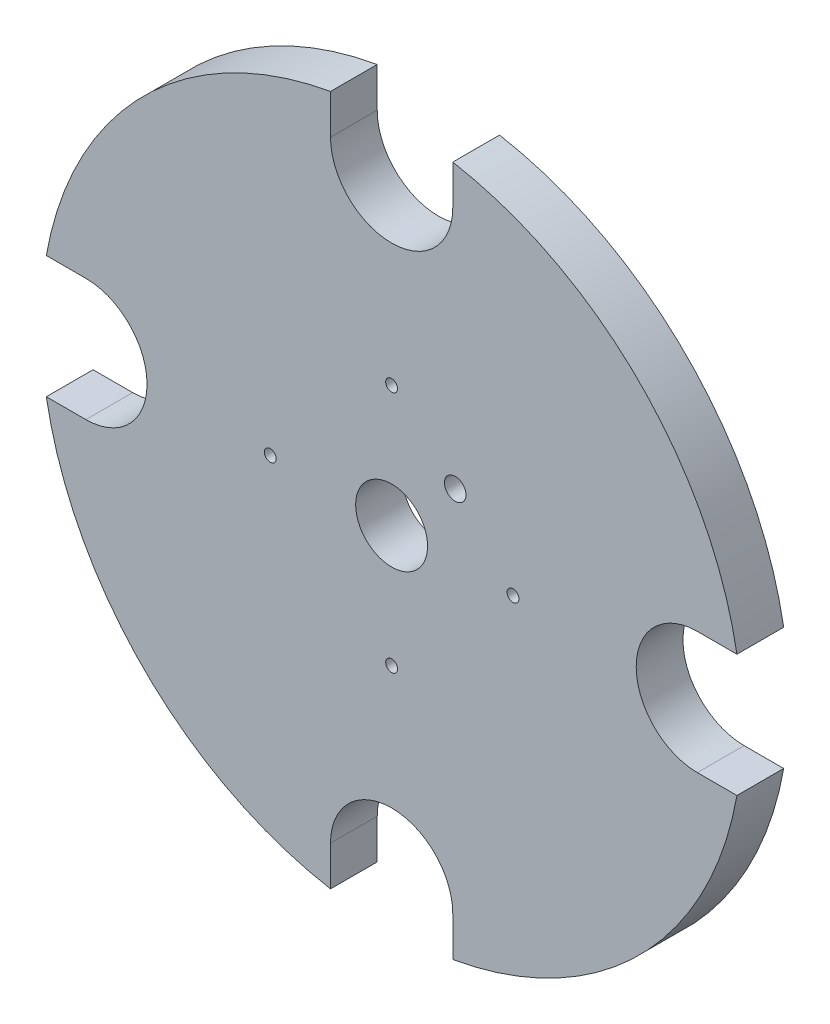
ISO-10303-21;
HEADER;
FILE_DESCRIPTION(('STEP AP214'),'2;1');
FILE_NAME('part.step','',(''),(''),'','','');
FILE_SCHEMA(('AUTOMOTIVE_DESIGN { 1 0 10303 214 1 1 1 1 }'));
ENDSEC;
DATA;
#1=APPLICATION_CONTEXT('core data for automotive mechanical design processes');
#2=APPLICATION_PROTOCOL_DEFINITION('international standard','automotive_design',2000,#1);
#3=PRODUCT_CONTEXT('',#1,'mechanical');
#4=PRODUCT('Part','Part','',(#3));
#5=PRODUCT_RELATED_PRODUCT_CATEGORY('part','',(#4));
#6=PRODUCT_DEFINITION_FORMATION('','',#4);
#7=PRODUCT_DEFINITION_CONTEXT('part definition',#1,'design');
#8=PRODUCT_DEFINITION('design','',#6,#7);
#9=PRODUCT_DEFINITION_SHAPE('','',#8);
#10=(LENGTH_UNIT() NAMED_UNIT(*) SI_UNIT(.MILLI.,.METRE.));
#11=(NAMED_UNIT(*) PLANE_ANGLE_UNIT() SI_UNIT($,.RADIAN.));
#12=(NAMED_UNIT(*) SI_UNIT($,.STERADIAN.) SOLID_ANGLE_UNIT());
#13=UNCERTAINTY_MEASURE_WITH_UNIT(LENGTH_MEASURE(1.E-05),#10,'distance_accuracy_value','');
#14=(GEOMETRIC_REPRESENTATION_CONTEXT(3) GLOBAL_UNCERTAINTY_ASSIGNED_CONTEXT((#13)) GLOBAL_UNIT_ASSIGNED_CONTEXT((#10,
#11,#12)) REPRESENTATION_CONTEXT('',''));
#15=CARTESIAN_POINT('',(0.,0.,0.));
#16=DIRECTION('',(0.,0.,1.));
#17=DIRECTION('',(1.,0.,0.));
#18=AXIS2_PLACEMENT_3D('',#15,#16,#17);
#19=CARTESIAN_POINT('',(35.3553390593274,35.3553390593274,-1.04603825601401E-11));
#20=DIRECTION('',(0.,0.,1.));
#21=DIRECTION('',(1.,0.,0.));
#22=AXIS2_PLACEMENT_3D('',#19,#20,#21);
#23=CYLINDRICAL_SURFACE('',#22,6.00000000000001);
#24=CARTESIAN_POINT('',(35.3553390593274,35.3553390593274,26.));
#25=DIRECTION('',(0.,0.,1.));
#26=DIRECTION('',(1.,0.,0.));
#27=AXIS2_PLACEMENT_3D('',#24,#25,#26);
#28=CIRCLE('',#27,6.00000000000001);
#29=CARTESIAN_POINT('',(41.3553390593274,35.3553390593274,26.));
#30=VERTEX_POINT('',#29);
#31=EDGE_CURVE('E382',#30,#30,#28,.T.);
#32=ORIENTED_EDGE('',*,*,#31,.T.);
#33=EDGE_LOOP('',(#32));
#34=FACE_BOUND('',#33,.T.);
#35=CARTESIAN_POINT('',(35.3553390593274,35.3553390593274,14.));
#36=DIRECTION('',(0.,0.,-1.));
#37=DIRECTION('',(-1.,0.,0.));
#38=AXIS2_PLACEMENT_3D('',#35,#36,#37);
#39=CIRCLE('',#38,6.00000000000001);
#40=CARTESIAN_POINT('',(29.3553390593274,35.3553390593274,14.));
#41=VERTEX_POINT('',#40);
#42=EDGE_CURVE('E37',#41,#41,#39,.F.);
#43=ORIENTED_EDGE('',*,*,#42,.F.);
#44=EDGE_LOOP('',(#43));
#45=FACE_BOUND('',#44,.T.);
#46=ADVANCED_FACE('F33',(#34,#45),#23,.F.);
#47=CARTESIAN_POINT('',(0.,0.,26.));
#48=DIRECTION('',(0.,0.,-1.));
#49=DIRECTION('',(-1.,0.,0.));
#50=AXIS2_PLACEMENT_3D('',#47,#48,#49);
#51=CYLINDRICAL_SURFACE('',#50,195.);
#52=CARTESIAN_POINT('',(0.,0.,26.));
#53=DIRECTION('',(0.,0.,1.));
#54=DIRECTION('',(1.,0.,0.));
#55=AXIS2_PLACEMENT_3D('',#52,#53,#54);
#56=CIRCLE('',#55,195.);
#57=CARTESIAN_POINT('',(-33.999999999998,192.013020391848,26.));
#58=VERTEX_POINT('',#57);
#59=CARTESIAN_POINT('',(-192.013020391847,34.0000000000013,26.));
#60=VERTEX_POINT('',#59);
#61=EDGE_CURVE('E42',#58,#60,#56,.T.);
#62=ORIENTED_EDGE('',*,*,#61,.F.);
#63=DIRECTION('',(0.,0.,1.));
#64=VECTOR('',#63,1.);
#65=CARTESIAN_POINT('',(-33.999999999998,192.013020391848,0.));
#66=LINE('',#65,#64);
#67=CARTESIAN_POINT('',(-33.999999999998,192.013020391848,0.));
#68=VERTEX_POINT('',#67);
#69=EDGE_CURVE('E181',#68,#58,#66,.T.);
#70=ORIENTED_EDGE('',*,*,#69,.F.);
#71=CARTESIAN_POINT('',(0.,0.,0.));
#72=DIRECTION('',(0.,0.,1.));
#73=DIRECTION('',(1.,0.,0.));
#74=AXIS2_PLACEMENT_3D('',#71,#72,#73);
#75=CIRCLE('',#74,195.);
#76=CARTESIAN_POINT('',(-192.013020391847,34.0000000000014,0.));
#77=VERTEX_POINT('',#76);
#78=EDGE_CURVE('E272',#68,#77,#75,.T.);
#79=ORIENTED_EDGE('',*,*,#78,.T.);
#80=DIRECTION('',(0.,0.,1.));
#81=VECTOR('',#80,1.);
#82=CARTESIAN_POINT('',(-192.013020391847,34.0000000000014,0.));
#83=LINE('',#82,#81);
#84=EDGE_CURVE('E206',#77,#60,#83,.T.);
#85=ORIENTED_EDGE('',*,*,#84,.T.);
#86=EDGE_LOOP('',(#62,#70,#79,#85));
#87=FACE_BOUND('',#86,.T.);
#88=ADVANCED_FACE('F313',(#87),#51,.T.);
#89=CARTESIAN_POINT('',(-192.013020391848,-33.9999999999987,26.));
#90=VERTEX_POINT('',#89);
#91=CARTESIAN_POINT('',(-34.0000000000007,-192.013020391847,26.));
#92=VERTEX_POINT('',#91);
#93=EDGE_CURVE('E276',#90,#92,#56,.T.);
#94=ORIENTED_EDGE('',*,*,#93,.F.);
#95=DIRECTION('',(0.,0.,1.));
#96=VECTOR('',#95,1.);
#97=CARTESIAN_POINT('',(-192.013020391848,-33.9999999999987,0.));
#98=LINE('',#97,#96);
#99=CARTESIAN_POINT('',(-192.013020391848,-33.9999999999987,0.));
#100=VERTEX_POINT('',#99);
#101=EDGE_CURVE('E204',#100,#90,#98,.T.);
#102=ORIENTED_EDGE('',*,*,#101,.F.);
#103=CARTESIAN_POINT('',(-34.0000000000007,-192.013020391847,0.));
#104=VERTEX_POINT('',#103);
#105=EDGE_CURVE('E277',#100,#104,#75,.T.);
#106=ORIENTED_EDGE('',*,*,#105,.T.);
#107=DIRECTION('',(0.,0.,1.));
#108=VECTOR('',#107,1.);
#109=CARTESIAN_POINT('',(-34.0000000000007,-192.013020391847,0.));
#110=LINE('',#109,#108);
#111=EDGE_CURVE('E233',#104,#92,#110,.T.);
#112=ORIENTED_EDGE('',*,*,#111,.T.);
#113=EDGE_LOOP('',(#94,#102,#106,#112));
#114=FACE_BOUND('',#113,.T.);
#115=ADVANCED_FACE('F287',(#114),#51,.T.);
#116=CARTESIAN_POINT('',(33.9999999999993,-192.013020391848,26.));
#117=VERTEX_POINT('',#116);
#118=CARTESIAN_POINT('',(192.013020391847,-34.,26.));
#119=VERTEX_POINT('',#118);
#120=EDGE_CURVE('E43',#117,#119,#56,.T.);
#121=ORIENTED_EDGE('',*,*,#120,.F.);
#122=DIRECTION('',(0.,0.,1.));
#123=VECTOR('',#122,1.);
#124=CARTESIAN_POINT('',(33.9999999999993,-192.013020391848,0.));
#125=LINE('',#124,#123);
#126=CARTESIAN_POINT('',(33.9999999999993,-192.013020391848,0.));
#127=VERTEX_POINT('',#126);
#128=EDGE_CURVE('E231',#127,#117,#125,.T.);
#129=ORIENTED_EDGE('',*,*,#128,.F.);
#130=CARTESIAN_POINT('',(192.013020391847,-34.,0.));
#131=VERTEX_POINT('',#130);
#132=EDGE_CURVE('E269',#127,#131,#75,.T.);
#133=ORIENTED_EDGE('',*,*,#132,.T.);
#134=DIRECTION('',(0.,0.,1.));
#135=VECTOR('',#134,1.);
#136=CARTESIAN_POINT('',(192.013020391847,-34.,0.));
#137=LINE('',#136,#135);
#138=EDGE_CURVE('E260',#131,#119,#137,.T.);
#139=ORIENTED_EDGE('',*,*,#138,.T.);
#140=EDGE_LOOP('',(#121,#129,#133,#139));
#141=FACE_BOUND('',#140,.T.);
#142=ADVANCED_FACE('F405',(#141),#51,.T.);
#143=CARTESIAN_POINT('',(0.,0.,26.));
#144=DIRECTION('',(0.,0.,1.));
#145=DIRECTION('',(1.,0.,0.));
#146=AXIS2_PLACEMENT_3D('',#143,#144,#145);
#147=PLANE('',#146);
#148=ORIENTED_EDGE('',*,*,#31,.F.);
#149=EDGE_LOOP('',(#148));
#150=FACE_BOUND('',#149,.T.);
#151=CARTESIAN_POINT('',(0.,67.5,26.));
#152=DIRECTION('',(0.,0.,1.));
#153=DIRECTION('',(1.,0.,0.));
#154=AXIS2_PLACEMENT_3D('',#151,#152,#153);
#155=CIRCLE('',#154,3.29999999999999);
#156=CARTESIAN_POINT('',(3.29999999999999,67.5,26.));
#157=VERTEX_POINT('',#156);
#158=EDGE_CURVE('E376',#157,#157,#155,.T.);
#159=ORIENTED_EDGE('',*,*,#158,.F.);
#160=EDGE_LOOP('',(#159));
#161=FACE_BOUND('',#160,.T.);
#162=CARTESIAN_POINT('',(67.5,0.,26.));
#163=DIRECTION('',(0.,0.,1.));
#164=DIRECTION('',(1.,0.,0.));
#165=AXIS2_PLACEMENT_3D('',#162,#163,#164);
#166=CIRCLE('',#165,3.29999999999998);
#167=CARTESIAN_POINT('',(70.8,0.,26.));
#168=VERTEX_POINT('',#167);
#169=EDGE_CURVE('E370',#168,#168,#166,.T.);
#170=ORIENTED_EDGE('',*,*,#169,.F.);
#171=EDGE_LOOP('',(#170));
#172=FACE_BOUND('',#171,.T.);
#173=CARTESIAN_POINT('',(0.,-67.5,26.));
#174=DIRECTION('',(0.,0.,1.));
#175=DIRECTION('',(1.,0.,0.));
#176=AXIS2_PLACEMENT_3D('',#173,#174,#175);
#177=CIRCLE('',#176,3.29999999999999);
#178=CARTESIAN_POINT('',(3.29999999999999,-67.5,26.));
#179=VERTEX_POINT('',#178);
#180=EDGE_CURVE('E362',#179,#179,#177,.T.);
#181=ORIENTED_EDGE('',*,*,#180,.F.);
#182=EDGE_LOOP('',(#181));
#183=FACE_BOUND('',#182,.T.);
#184=CARTESIAN_POINT('',(-67.5,0.,26.));
#185=DIRECTION('',(0.,0.,1.));
#186=DIRECTION('',(1.,0.,0.));
#187=AXIS2_PLACEMENT_3D('',#184,#185,#186);
#188=CIRCLE('',#187,3.29999999999998);
#189=CARTESIAN_POINT('',(-64.2,0.,26.));
#190=VERTEX_POINT('',#189);
#191=EDGE_CURVE('E163',#190,#190,#188,.T.);
#192=ORIENTED_EDGE('',*,*,#191,.F.);
#193=EDGE_LOOP('',(#192));
#194=FACE_BOUND('',#193,.T.);
#195=DIRECTION('',(0.,-1.,0.));
#196=VECTOR('',#195,1.);
#197=CARTESIAN_POINT('',(-33.9999999999982,170.,26.));
#198=LINE('',#197,#196);
#199=CARTESIAN_POINT('',(-33.9999999999982,170.,26.));
#200=VERTEX_POINT('',#199);
#201=EDGE_CURVE('E169',#58,#200,#198,.T.);
#202=ORIENTED_EDGE('',*,*,#201,.F.);
#203=ORIENTED_EDGE('',*,*,#61,.T.);
#204=DIRECTION('',(-1.,0.,0.));
#205=VECTOR('',#204,1.);
#206=CARTESIAN_POINT('',(-170.,34.0000000000012,26.));
#207=LINE('',#206,#205);
#208=CARTESIAN_POINT('',(-170.,34.0000000000012,26.));
#209=VERTEX_POINT('',#208);
#210=EDGE_CURVE('E186',#209,#60,#207,.T.);
#211=ORIENTED_EDGE('',*,*,#210,.F.);
#212=CARTESIAN_POINT('',(-170.,1.18710434277719E-12,26.));
#213=DIRECTION('',(0.,0.,1.));
#214=DIRECTION('',(1.,0.,0.));
#215=AXIS2_PLACEMENT_3D('',#212,#213,#214);
#216=CIRCLE('',#215,34.);
#217=CARTESIAN_POINT('',(-170.,-33.9999999999988,26.));
#218=VERTEX_POINT('',#217);
#219=EDGE_CURVE('E180',#218,#209,#216,.T.);
#220=ORIENTED_EDGE('',*,*,#219,.F.);
#221=DIRECTION('',(1.,0.,0.));
#222=VECTOR('',#221,1.);
#223=CARTESIAN_POINT('',(-170.,-33.9999999999988,26.));
#224=LINE('',#223,#222);
#225=EDGE_CURVE('E188',#90,#218,#224,.T.);
#226=ORIENTED_EDGE('',*,*,#225,.F.);
#227=ORIENTED_EDGE('',*,*,#93,.T.);
#228=DIRECTION('',(0.,-1.,0.));
#229=VECTOR('',#228,1.);
#230=CARTESIAN_POINT('',(-34.0000000000006,-170.,26.));
#231=LINE('',#230,#229);
#232=CARTESIAN_POINT('',(-34.0000000000006,-170.,26.));
#233=VERTEX_POINT('',#232);
#234=EDGE_CURVE('E212',#233,#92,#231,.T.);
#235=ORIENTED_EDGE('',*,*,#234,.F.);
#236=CARTESIAN_POINT('',(-5.93552171388595E-13,-170.,26.));
#237=DIRECTION('',(0.,0.,1.));
#238=DIRECTION('',(1.,0.,0.));
#239=AXIS2_PLACEMENT_3D('',#236,#237,#238);
#240=CIRCLE('',#239,34.);
#241=CARTESIAN_POINT('',(33.9999999999994,-170.,26.));
#242=VERTEX_POINT('',#241);
#243=EDGE_CURVE('E203',#242,#233,#240,.T.);
#244=ORIENTED_EDGE('',*,*,#243,.F.);
#245=DIRECTION('',(0.,1.,0.));
#246=VECTOR('',#245,1.);
#247=CARTESIAN_POINT('',(33.9999999999994,-170.,26.));
#248=LINE('',#247,#246);
#249=EDGE_CURVE('E215',#117,#242,#248,.T.);
#250=ORIENTED_EDGE('',*,*,#249,.F.);
#251=ORIENTED_EDGE('',*,*,#120,.T.);
#252=DIRECTION('',(1.,0.,0.));
#253=VECTOR('',#252,1.);
#254=CARTESIAN_POINT('',(170.,-34.,26.));
#255=LINE('',#254,#253);
#256=CARTESIAN_POINT('',(170.,-34.,26.));
#257=VERTEX_POINT('',#256);
#258=EDGE_CURVE('E239',#257,#119,#255,.T.);
#259=ORIENTED_EDGE('',*,*,#258,.F.);
#260=CARTESIAN_POINT('',(170.,0.,26.));
#261=DIRECTION('',(0.,0.,1.));
#262=DIRECTION('',(1.,0.,0.));
#263=AXIS2_PLACEMENT_3D('',#260,#261,#262);
#264=CIRCLE('',#263,34.);
#265=CARTESIAN_POINT('',(170.,34.,26.));
#266=VERTEX_POINT('',#265);
#267=EDGE_CURVE('E230',#266,#257,#264,.T.);
#268=ORIENTED_EDGE('',*,*,#267,.F.);
#269=DIRECTION('',(-1.,0.,0.));
#270=VECTOR('',#269,1.);
#271=CARTESIAN_POINT('',(170.,34.,26.));
#272=LINE('',#271,#270);
#273=CARTESIAN_POINT('',(192.013020391847,34.,26.));
#274=VERTEX_POINT('',#273);
#275=EDGE_CURVE('E242',#274,#266,#272,.T.);
#276=ORIENTED_EDGE('',*,*,#275,.F.);
#277=CARTESIAN_POINT('',(34.000000000002,192.013020391847,26.));
#278=VERTEX_POINT('',#277);
#279=EDGE_CURVE('E11',#274,#278,#56,.T.);
#280=ORIENTED_EDGE('',*,*,#279,.T.);
#281=DIRECTION('',(0.,1.,0.));
#282=VECTOR('',#281,1.);
#283=CARTESIAN_POINT('',(34.0000000000018,170.,26.));
#284=LINE('',#283,#282);
#285=CARTESIAN_POINT('',(34.0000000000018,170.,26.));
#286=VERTEX_POINT('',#285);
#287=EDGE_CURVE('E50',#286,#278,#284,.T.);
#288=ORIENTED_EDGE('',*,*,#287,.F.);
#289=CARTESIAN_POINT('',(1.78065651416579E-12,170.,26.));
#290=DIRECTION('',(0.,0.,1.));
#291=DIRECTION('',(1.,0.,0.));
#292=AXIS2_PLACEMENT_3D('',#289,#290,#291);
#293=CIRCLE('',#292,34.);
#294=EDGE_CURVE('E159',#200,#286,#293,.T.);
#295=ORIENTED_EDGE('',*,*,#294,.F.);
#296=EDGE_LOOP('',(#202,#203,#211,#220,#226,#227,#235,#244,#250,#251,#259,#268,#276,#280,#288,#295));
#297=FACE_BOUND('',#296,.T.);
#298=CARTESIAN_POINT('',(0.,0.,26.));
#299=DIRECTION('',(0.,0.,1.));
#300=DIRECTION('',(1.,0.,0.));
#301=AXIS2_PLACEMENT_3D('',#298,#299,#300);
#302=CIRCLE('',#301,20.);
#303=CARTESIAN_POINT('',(-20.,0.,26.));
#304=VERTEX_POINT('',#303);
#305=EDGE_CURVE('E266',#304,#304,#302,.T.);
#306=ORIENTED_EDGE('',*,*,#305,.F.);
#307=EDGE_LOOP('',(#306));
#308=FACE_BOUND('',#307,.T.);
#309=ADVANCED_FACE('F165',(#150,#161,#172,#183,#194,#297,#308),#147,.T.);
#310=CARTESIAN_POINT('',(0.,0.,0.));
#311=DIRECTION('',(0.,0.,1.));
#312=DIRECTION('',(1.,0.,0.));
#313=AXIS2_PLACEMENT_3D('',#310,#311,#312);
#314=PLANE('',#313);
#315=CARTESIAN_POINT('',(35.3553390593274,35.3553390593274,0.));
#316=DIRECTION('',(0.,0.,-1.));
#317=DIRECTION('',(-1.,0.,0.));
#318=AXIS2_PLACEMENT_3D('',#315,#316,#317);
#319=CIRCLE('',#318,18.);
#320=CARTESIAN_POINT('',(17.3553390593274,35.3553390593274,0.));
#321=VERTEX_POINT('',#320);
#322=EDGE_CURVE('E387',#321,#321,#319,.T.);
#323=ORIENTED_EDGE('',*,*,#322,.F.);
#324=EDGE_LOOP('',(#323));
#325=FACE_BOUND('',#324,.T.);
#326=CARTESIAN_POINT('',(0.,67.5,-1.04603825601401E-11));
#327=DIRECTION('',(0.,0.,1.));
#328=DIRECTION('',(1.,0.,0.));
#329=AXIS2_PLACEMENT_3D('',#326,#327,#328);
#330=CIRCLE('',#329,3.3);
#331=CARTESIAN_POINT('',(3.3,67.5,-1.04603825601401E-11));
#332=VERTEX_POINT('',#331);
#333=EDGE_CURVE('E379',#332,#332,#330,.T.);
#334=ORIENTED_EDGE('',*,*,#333,.T.);
#335=EDGE_LOOP('',(#334));
#336=FACE_BOUND('',#335,.T.);
#337=CARTESIAN_POINT('',(67.5,0.,-1.04603825601401E-11));
#338=DIRECTION('',(0.,0.,1.));
#339=DIRECTION('',(1.,0.,0.));
#340=AXIS2_PLACEMENT_3D('',#337,#338,#339);
#341=CIRCLE('',#340,3.3);
#342=CARTESIAN_POINT('',(70.8,0.,-1.04603825601401E-11));
#343=VERTEX_POINT('',#342);
#344=EDGE_CURVE('E373',#343,#343,#341,.T.);
#345=ORIENTED_EDGE('',*,*,#344,.T.);
#346=EDGE_LOOP('',(#345));
#347=FACE_BOUND('',#346,.T.);
#348=CARTESIAN_POINT('',(0.,-67.5,-1.04603825601401E-11));
#349=DIRECTION('',(0.,0.,1.));
#350=DIRECTION('',(1.,0.,0.));
#351=AXIS2_PLACEMENT_3D('',#348,#349,#350);
#352=CIRCLE('',#351,3.3);
#353=CARTESIAN_POINT('',(3.3,-67.5,-1.04603825601401E-11));
#354=VERTEX_POINT('',#353);
#355=EDGE_CURVE('E367',#354,#354,#352,.T.);
#356=ORIENTED_EDGE('',*,*,#355,.T.);
#357=EDGE_LOOP('',(#356));
#358=FACE_BOUND('',#357,.T.);
#359=CARTESIAN_POINT('',(-67.5,0.,-1.04603825601401E-11));
#360=DIRECTION('',(0.,0.,1.));
#361=DIRECTION('',(1.,0.,0.));
#362=AXIS2_PLACEMENT_3D('',#359,#360,#361);
#363=CIRCLE('',#362,3.3);
#364=CARTESIAN_POINT('',(-64.2,0.,-1.04603825601401E-11));
#365=VERTEX_POINT('',#364);
#366=EDGE_CURVE('E358',#365,#365,#363,.T.);
#367=ORIENTED_EDGE('',*,*,#366,.T.);
#368=EDGE_LOOP('',(#367));
#369=FACE_BOUND('',#368,.T.);
#370=ORIENTED_EDGE('',*,*,#78,.F.);
#371=DIRECTION('',(0.,-1.,0.));
#372=VECTOR('',#371,1.);
#373=CARTESIAN_POINT('',(-33.9999999999982,170.,0.));
#374=LINE('',#373,#372);
#375=CARTESIAN_POINT('',(-33.9999999999982,170.,0.));
#376=VERTEX_POINT('',#375);
#377=EDGE_CURVE('E156',#68,#376,#374,.T.);
#378=ORIENTED_EDGE('',*,*,#377,.T.);
#379=CARTESIAN_POINT('',(1.78065651416579E-12,170.,0.));
#380=DIRECTION('',(0.,0.,1.));
#381=DIRECTION('',(1.,0.,0.));
#382=AXIS2_PLACEMENT_3D('',#379,#380,#381);
#383=CIRCLE('',#382,34.);
#384=CARTESIAN_POINT('',(34.0000000000018,170.,0.));
#385=VERTEX_POINT('',#384);
#386=EDGE_CURVE('E171',#376,#385,#383,.T.);
#387=ORIENTED_EDGE('',*,*,#386,.T.);
#388=DIRECTION('',(0.,1.,0.));
#389=VECTOR('',#388,1.);
#390=CARTESIAN_POINT('',(34.0000000000018,170.,0.));
#391=LINE('',#390,#389);
#392=CARTESIAN_POINT('',(34.000000000002,192.013020391847,0.));
#393=VERTEX_POINT('',#392);
#394=EDGE_CURVE('E151',#385,#393,#391,.T.);
#395=ORIENTED_EDGE('',*,*,#394,.T.);
#396=CARTESIAN_POINT('',(192.013020391847,34.,0.));
#397=VERTEX_POINT('',#396);
#398=EDGE_CURVE('E270',#397,#393,#75,.T.);
#399=ORIENTED_EDGE('',*,*,#398,.F.);
#400=DIRECTION('',(-1.,0.,0.));
#401=VECTOR('',#400,1.);
#402=CARTESIAN_POINT('',(170.,34.,0.));
#403=LINE('',#402,#401);
#404=CARTESIAN_POINT('',(170.,34.,0.));
#405=VERTEX_POINT('',#404);
#406=EDGE_CURVE('E251',#397,#405,#403,.T.);
#407=ORIENTED_EDGE('',*,*,#406,.T.);
#408=CARTESIAN_POINT('',(170.,0.,0.));
#409=DIRECTION('',(0.,0.,1.));
#410=DIRECTION('',(1.,0.,0.));
#411=AXIS2_PLACEMENT_3D('',#408,#409,#410);
#412=CIRCLE('',#411,34.);
#413=CARTESIAN_POINT('',(170.,-34.,0.));
#414=VERTEX_POINT('',#413);
#415=EDGE_CURVE('E245',#405,#414,#412,.T.);
#416=ORIENTED_EDGE('',*,*,#415,.T.);
#417=DIRECTION('',(1.,0.,0.));
#418=VECTOR('',#417,1.);
#419=CARTESIAN_POINT('',(170.,-34.,0.));
#420=LINE('',#419,#418);
#421=EDGE_CURVE('E248',#414,#131,#420,.T.);
#422=ORIENTED_EDGE('',*,*,#421,.T.);
#423=ORIENTED_EDGE('',*,*,#132,.F.);
#424=DIRECTION('',(0.,1.,0.));
#425=VECTOR('',#424,1.);
#426=CARTESIAN_POINT('',(33.9999999999994,-170.,0.));
#427=LINE('',#426,#425);
#428=CARTESIAN_POINT('',(33.9999999999994,-170.,0.));
#429=VERTEX_POINT('',#428);
#430=EDGE_CURVE('E224',#127,#429,#427,.T.);
#431=ORIENTED_EDGE('',*,*,#430,.T.);
#432=CARTESIAN_POINT('',(-5.93552171388595E-13,-170.,0.));
#433=DIRECTION('',(0.,0.,1.));
#434=DIRECTION('',(1.,0.,0.));
#435=AXIS2_PLACEMENT_3D('',#432,#433,#434);
#436=CIRCLE('',#435,34.);
#437=CARTESIAN_POINT('',(-34.0000000000006,-170.,0.));
#438=VERTEX_POINT('',#437);
#439=EDGE_CURVE('E218',#429,#438,#436,.T.);
#440=ORIENTED_EDGE('',*,*,#439,.T.);
#441=DIRECTION('',(0.,-1.,0.));
#442=VECTOR('',#441,1.);
#443=CARTESIAN_POINT('',(-34.0000000000006,-170.,0.));
#444=LINE('',#443,#442);
#445=EDGE_CURVE('E221',#438,#104,#444,.T.);
#446=ORIENTED_EDGE('',*,*,#445,.T.);
#447=ORIENTED_EDGE('',*,*,#105,.F.);
#448=DIRECTION('',(1.,0.,0.));
#449=VECTOR('',#448,1.);
#450=CARTESIAN_POINT('',(-170.,-33.9999999999988,0.));
#451=LINE('',#450,#449);
#452=CARTESIAN_POINT('',(-170.,-33.9999999999988,0.));
#453=VERTEX_POINT('',#452);
#454=EDGE_CURVE('E197',#100,#453,#451,.T.);
#455=ORIENTED_EDGE('',*,*,#454,.T.);
#456=CARTESIAN_POINT('',(-170.,1.18710434277719E-12,0.));
#457=DIRECTION('',(0.,0.,1.));
#458=DIRECTION('',(1.,0.,0.));
#459=AXIS2_PLACEMENT_3D('',#456,#457,#458);
#460=CIRCLE('',#459,34.);
#461=CARTESIAN_POINT('',(-170.,34.0000000000012,0.));
#462=VERTEX_POINT('',#461);
#463=EDGE_CURVE('E191',#453,#462,#460,.T.);
#464=ORIENTED_EDGE('',*,*,#463,.T.);
#465=DIRECTION('',(-1.,0.,0.));
#466=VECTOR('',#465,1.);
#467=CARTESIAN_POINT('',(-170.,34.0000000000012,0.));
#468=LINE('',#467,#466);
#469=EDGE_CURVE('E194',#462,#77,#468,.T.);
#470=ORIENTED_EDGE('',*,*,#469,.T.);
#471=EDGE_LOOP('',(#370,#378,#387,#395,#399,#407,#416,#422,#423,#431,#440,#446,#447,#455,#464,#470));
#472=FACE_BOUND('',#471,.T.);
#473=CARTESIAN_POINT('',(0.,0.,0.));
#474=DIRECTION('',(0.,0.,1.));
#475=DIRECTION('',(1.,0.,0.));
#476=AXIS2_PLACEMENT_3D('',#473,#474,#475);
#477=CIRCLE('',#476,20.);
#478=CARTESIAN_POINT('',(-20.,0.,0.));
#479=VERTEX_POINT('',#478);
#480=EDGE_CURVE('E257',#479,#479,#477,.T.);
#481=ORIENTED_EDGE('',*,*,#480,.T.);
#482=EDGE_LOOP('',(#481));
#483=FACE_BOUND('',#482,.T.);
#484=ADVANCED_FACE('F294',(#325,#336,#347,#358,#369,#472,#483),#314,.F.);
#485=ORIENTED_EDGE('',*,*,#398,.T.);
#486=DIRECTION('',(0.,0.,1.));
#487=VECTOR('',#486,1.);
#488=CARTESIAN_POINT('',(34.000000000002,192.013020391847,0.));
#489=LINE('',#488,#487);
#490=EDGE_CURVE('E155',#393,#278,#489,.T.);
#491=ORIENTED_EDGE('',*,*,#490,.T.);
#492=ORIENTED_EDGE('',*,*,#279,.F.);
#493=DIRECTION('',(0.,0.,1.));
#494=VECTOR('',#493,1.);
#495=CARTESIAN_POINT('',(192.013020391847,34.,0.));
#496=LINE('',#495,#494);
#497=EDGE_CURVE('E258',#397,#274,#496,.T.);
#498=ORIENTED_EDGE('',*,*,#497,.F.);
#499=EDGE_LOOP('',(#485,#491,#492,#498));
#500=FACE_BOUND('',#499,.T.);
#501=ADVANCED_FACE('F35',(#500),#51,.T.);
#502=CARTESIAN_POINT('',(0.,0.,26.));
#503=DIRECTION('',(0.,0.,-1.));
#504=DIRECTION('',(-1.,0.,0.));
#505=AXIS2_PLACEMENT_3D('',#502,#503,#504);
#506=CYLINDRICAL_SURFACE('',#505,20.);
#507=CARTESIAN_POINT('',(-20.,0.,26.));
#508=CARTESIAN_POINT('',(-20.,0.,25.7291666666667));
#509=CARTESIAN_POINT('',(-20.,0.,25.4583333333333));
#510=CARTESIAN_POINT('',(-20.,0.,24.9166666666667));
#511=CARTESIAN_POINT('',(-20.,0.,24.6458333333333));
#512=CARTESIAN_POINT('',(-20.,0.,24.1041666666667));
#513=CARTESIAN_POINT('',(-20.,0.,23.8333333333333));
#514=CARTESIAN_POINT('',(-20.,0.,23.2916666666667));
#515=CARTESIAN_POINT('',(-20.,0.,23.0208333333333));
#516=CARTESIAN_POINT('',(-20.,0.,22.4791666666667));
#517=CARTESIAN_POINT('',(-20.,0.,22.2083333333333));
#518=CARTESIAN_POINT('',(-20.,0.,21.6666666666667));
#519=CARTESIAN_POINT('',(-20.,0.,21.3958333333333));
#520=CARTESIAN_POINT('',(-20.,0.,20.8541666666667));
#521=CARTESIAN_POINT('',(-20.,0.,20.5833333333333));
#522=CARTESIAN_POINT('',(-20.,0.,20.0416666666667));
#523=CARTESIAN_POINT('',(-20.,0.,19.7708333333333));
#524=CARTESIAN_POINT('',(-20.,0.,19.2291666666667));
#525=CARTESIAN_POINT('',(-20.,0.,18.9583333333333));
#526=CARTESIAN_POINT('',(-20.,0.,18.4166666666667));
#527=CARTESIAN_POINT('',(-20.,0.,18.1458333333333));
#528=CARTESIAN_POINT('',(-20.,0.,17.6041666666667));
#529=CARTESIAN_POINT('',(-20.,0.,17.3333333333333));
#530=CARTESIAN_POINT('',(-20.,0.,16.7916666666667));
#531=CARTESIAN_POINT('',(-20.,0.,16.5208333333333));
#532=CARTESIAN_POINT('',(-20.,0.,15.9791666666667));
#533=CARTESIAN_POINT('',(-20.,0.,15.7083333333333));
#534=CARTESIAN_POINT('',(-20.,0.,15.1666666666667));
#535=CARTESIAN_POINT('',(-20.,0.,14.8958333333333));
#536=CARTESIAN_POINT('',(-20.,0.,14.3541666666667));
#537=CARTESIAN_POINT('',(-20.,0.,14.0833333333333));
#538=CARTESIAN_POINT('',(-20.,0.,13.5416666666667));
#539=CARTESIAN_POINT('',(-20.,0.,13.2708333333333));
#540=CARTESIAN_POINT('',(-20.,0.,12.7291666666667));
#541=CARTESIAN_POINT('',(-20.,0.,12.4583333333333));
#542=CARTESIAN_POINT('',(-20.,0.,11.9166666666667));
#543=CARTESIAN_POINT('',(-20.,0.,11.6458333333333));
#544=CARTESIAN_POINT('',(-20.,0.,11.1041666666667));
#545=CARTESIAN_POINT('',(-20.,0.,10.8333333333333));
#546=CARTESIAN_POINT('',(-20.,0.,10.2916666666667));
#547=CARTESIAN_POINT('',(-20.,0.,10.0208333333333));
#548=CARTESIAN_POINT('',(-20.,0.,9.47916666666667));
#549=CARTESIAN_POINT('',(-20.,0.,9.20833333333333));
#550=CARTESIAN_POINT('',(-20.,0.,8.66666666666667));
#551=CARTESIAN_POINT('',(-20.,0.,8.39583333333333));
#552=CARTESIAN_POINT('',(-20.,0.,7.85416666666667));
#553=CARTESIAN_POINT('',(-20.,0.,7.58333333333333));
#554=CARTESIAN_POINT('',(-20.,0.,7.04166666666667));
#555=CARTESIAN_POINT('',(-20.,0.,6.77083333333333));
#556=CARTESIAN_POINT('',(-20.,0.,6.22916666666667));
#557=CARTESIAN_POINT('',(-20.,0.,5.95833333333333));
#558=CARTESIAN_POINT('',(-20.,0.,5.41666666666667));
#559=CARTESIAN_POINT('',(-20.,0.,5.14583333333333));
#560=CARTESIAN_POINT('',(-20.,0.,4.60416666666667));
#561=CARTESIAN_POINT('',(-20.,0.,4.33333333333333));
#562=CARTESIAN_POINT('',(-20.,0.,3.79166666666667));
#563=CARTESIAN_POINT('',(-20.,0.,3.52083333333333));
#564=CARTESIAN_POINT('',(-20.,0.,2.97916666666667));
#565=CARTESIAN_POINT('',(-20.,0.,2.70833333333333));
#566=CARTESIAN_POINT('',(-20.,0.,2.16666666666667));
#567=CARTESIAN_POINT('',(-20.,0.,1.89583333333333));
#568=CARTESIAN_POINT('',(-20.,0.,1.35416666666667));
#569=CARTESIAN_POINT('',(-20.,0.,1.08333333333333));
#570=CARTESIAN_POINT('',(-20.,0.,0.541666666666667));
#571=CARTESIAN_POINT('',(-20.,0.,0.270833333333334));
#572=CARTESIAN_POINT('',(-20.,0.,0.));
#573=B_SPLINE_CURVE_WITH_KNOTS('',3,(#507,#508,#509,#510,#511,#512,#513,#514,#515,#516,#517,
#518,#519,#520,#521,#522,#523,#524,#525,#526,#527,#528,#529,#530,#531,#532,#533,#534,#535,#536,
#537,#538,#539,#540,#541,#542,#543,#544,#545,#546,#547,#548,#549,#550,#551,#552,#553,#554,#555,
#556,#557,#558,#559,#560,#561,#562,#563,#564,#565,#566,#567,#568,#569,#570,#571,#572),
.UNSPECIFIED.,.F.,.F.,(4,2,2,2,2,2,2,2,2,2,2,2,2,2,2,2,2,2,2,2,2,2,2,2,2,2,2,2,2,2,2,2,4),(0.,
0.812500000000001,1.625,2.4375,3.25,4.0625,4.875,5.6875,6.5,7.3125,8.125,8.9375,9.75,10.5625,
11.375,12.1875,13.,13.8125,14.625,15.4375,16.25,17.0625,17.875,18.6875,19.5,20.3125,21.125,
21.9375,22.75,23.5625,24.375,25.1875,26.),.UNSPECIFIED.);
#574=EDGE_CURVE('BSEAM413',#304,#479,#573,.T.);
#575=ORIENTED_EDGE('',*,*,#305,.T.);
#576=ORIENTED_EDGE('',*,*,#480,.F.);
#577=ORIENTED_EDGE('',*,*,#574,.T.);
#578=ORIENTED_EDGE('',*,*,#574,.F.);
#579=EDGE_LOOP('',(#575,#577,#576,#578));
#580=FACE_BOUND('',#579,.T.);
#581=ADVANCED_FACE('F413',(#580),#506,.F.);
#582=CARTESIAN_POINT('',(170.,0.,0.));
#583=DIRECTION('',(0.,0.,1.));
#584=DIRECTION('',(1.,0.,0.));
#585=AXIS2_PLACEMENT_3D('',#582,#583,#584);
#586=CYLINDRICAL_SURFACE('',#585,34.);
#587=ORIENTED_EDGE('',*,*,#267,.T.);
#588=DIRECTION('',(0.,0.,1.));
#589=VECTOR('',#588,1.);
#590=CARTESIAN_POINT('',(170.,-34.,0.));
#591=LINE('',#590,#589);
#592=EDGE_CURVE('E254',#414,#257,#591,.T.);
#593=ORIENTED_EDGE('',*,*,#592,.F.);
#594=ORIENTED_EDGE('',*,*,#415,.F.);
#595=DIRECTION('',(0.,0.,1.));
#596=VECTOR('',#595,1.);
#597=CARTESIAN_POINT('',(170.,34.,0.));
#598=LINE('',#597,#596);
#599=EDGE_CURVE('E255',#405,#266,#598,.T.);
#600=ORIENTED_EDGE('',*,*,#599,.T.);
#601=EDGE_LOOP('',(#587,#593,#594,#600));
#602=FACE_BOUND('',#601,.T.);
#603=ADVANCED_FACE('F416',(#602),#586,.F.);
#604=CARTESIAN_POINT('',(170.,34.,0.));
#605=DIRECTION('',(0.,1.,0.));
#606=DIRECTION('',(0.,0.,1.));
#607=AXIS2_PLACEMENT_3D('',#604,#605,#606);
#608=PLANE('',#607);
#609=ORIENTED_EDGE('',*,*,#275,.T.);
#610=ORIENTED_EDGE('',*,*,#599,.F.);
#611=ORIENTED_EDGE('',*,*,#406,.F.);
#612=ORIENTED_EDGE('',*,*,#497,.T.);
#613=EDGE_LOOP('',(#609,#610,#611,#612));
#614=FACE_BOUND('',#613,.T.);
#615=ADVANCED_FACE('F420',(#614),#608,.F.);
#616=CARTESIAN_POINT('',(170.,-34.,0.));
#617=DIRECTION('',(0.,-1.,0.));
#618=DIRECTION('',(1.,0.,0.));
#619=AXIS2_PLACEMENT_3D('',#616,#617,#618);
#620=PLANE('',#619);
#621=ORIENTED_EDGE('',*,*,#258,.T.);
#622=ORIENTED_EDGE('',*,*,#138,.F.);
#623=ORIENTED_EDGE('',*,*,#421,.F.);
#624=ORIENTED_EDGE('',*,*,#592,.T.);
#625=EDGE_LOOP('',(#621,#622,#623,#624));
#626=FACE_BOUND('',#625,.T.);
#627=ADVANCED_FACE('F422',(#626),#620,.F.);
#628=CARTESIAN_POINT('',(-5.93552171388595E-13,-170.,0.));
#629=DIRECTION('',(0.,0.,1.));
#630=DIRECTION('',(1.,0.,0.));
#631=AXIS2_PLACEMENT_3D('',#628,#629,#630);
#632=CYLINDRICAL_SURFACE('',#631,34.);
#633=ORIENTED_EDGE('',*,*,#243,.T.);
#634=DIRECTION('',(0.,0.,1.));
#635=VECTOR('',#634,1.);
#636=CARTESIAN_POINT('',(-34.0000000000006,-170.,0.));
#637=LINE('',#636,#635);
#638=EDGE_CURVE('E227',#438,#233,#637,.T.);
#639=ORIENTED_EDGE('',*,*,#638,.F.);
#640=ORIENTED_EDGE('',*,*,#439,.F.);
#641=DIRECTION('',(0.,0.,1.));
#642=VECTOR('',#641,1.);
#643=CARTESIAN_POINT('',(33.9999999999994,-170.,0.));
#644=LINE('',#643,#642);
#645=EDGE_CURVE('E228',#429,#242,#644,.T.);
#646=ORIENTED_EDGE('',*,*,#645,.T.);
#647=EDGE_LOOP('',(#633,#639,#640,#646));
#648=FACE_BOUND('',#647,.T.);
#649=ADVANCED_FACE('F298',(#648),#632,.F.);
#650=CARTESIAN_POINT('',(33.9999999999994,-170.,0.));
#651=DIRECTION('',(1.,0.,0.));
#652=DIRECTION('',(0.,1.,0.));
#653=AXIS2_PLACEMENT_3D('',#650,#651,#652);
#654=PLANE('',#653);
#655=ORIENTED_EDGE('',*,*,#249,.T.);
#656=ORIENTED_EDGE('',*,*,#645,.F.);
#657=ORIENTED_EDGE('',*,*,#430,.F.);
#658=ORIENTED_EDGE('',*,*,#128,.T.);
#659=EDGE_LOOP('',(#655,#656,#657,#658));
#660=FACE_BOUND('',#659,.T.);
#661=ADVANCED_FACE('F431',(#660),#654,.F.);
#662=CARTESIAN_POINT('',(-34.0000000000006,-170.,0.));
#663=DIRECTION('',(-1.,0.,0.));
#664=DIRECTION('',(0.,-1.,0.));
#665=AXIS2_PLACEMENT_3D('',#662,#663,#664);
#666=PLANE('',#665);
#667=ORIENTED_EDGE('',*,*,#234,.T.);
#668=ORIENTED_EDGE('',*,*,#111,.F.);
#669=ORIENTED_EDGE('',*,*,#445,.F.);
#670=ORIENTED_EDGE('',*,*,#638,.T.);
#671=EDGE_LOOP('',(#667,#668,#669,#670));
#672=FACE_BOUND('',#671,.T.);
#673=ADVANCED_FACE('F291',(#672),#666,.F.);
#674=CARTESIAN_POINT('',(-170.,1.18710434277719E-12,0.));
#675=DIRECTION('',(0.,0.,1.));
#676=DIRECTION('',(1.,0.,0.));
#677=AXIS2_PLACEMENT_3D('',#674,#675,#676);
#678=CYLINDRICAL_SURFACE('',#677,34.);
#679=ORIENTED_EDGE('',*,*,#219,.T.);
#680=DIRECTION('',(0.,0.,1.));
#681=VECTOR('',#680,1.);
#682=CARTESIAN_POINT('',(-170.,34.0000000000012,0.));
#683=LINE('',#682,#681);
#684=EDGE_CURVE('E200',#462,#209,#683,.T.);
#685=ORIENTED_EDGE('',*,*,#684,.F.);
#686=ORIENTED_EDGE('',*,*,#463,.F.);
#687=DIRECTION('',(0.,0.,1.));
#688=VECTOR('',#687,1.);
#689=CARTESIAN_POINT('',(-170.,-33.9999999999988,0.));
#690=LINE('',#689,#688);
#691=EDGE_CURVE('E201',#453,#218,#690,.T.);
#692=ORIENTED_EDGE('',*,*,#691,.T.);
#693=EDGE_LOOP('',(#679,#685,#686,#692));
#694=FACE_BOUND('',#693,.T.);
#695=ADVANCED_FACE('F308',(#694),#678,.F.);
#696=CARTESIAN_POINT('',(-170.,-33.9999999999988,0.));
#697=DIRECTION('',(0.,-1.,0.));
#698=DIRECTION('',(1.,0.,0.));
#699=AXIS2_PLACEMENT_3D('',#696,#697,#698);
#700=PLANE('',#699);
#701=ORIENTED_EDGE('',*,*,#225,.T.);
#702=ORIENTED_EDGE('',*,*,#691,.F.);
#703=ORIENTED_EDGE('',*,*,#454,.F.);
#704=ORIENTED_EDGE('',*,*,#101,.T.);
#705=EDGE_LOOP('',(#701,#702,#703,#704));
#706=FACE_BOUND('',#705,.T.);
#707=ADVANCED_FACE('F304',(#706),#700,.F.);
#708=CARTESIAN_POINT('',(-170.,34.0000000000012,0.));
#709=DIRECTION('',(0.,1.,0.));
#710=DIRECTION('',(-1.,0.,0.));
#711=AXIS2_PLACEMENT_3D('',#708,#709,#710);
#712=PLANE('',#711);
#713=ORIENTED_EDGE('',*,*,#210,.T.);
#714=ORIENTED_EDGE('',*,*,#84,.F.);
#715=ORIENTED_EDGE('',*,*,#469,.F.);
#716=ORIENTED_EDGE('',*,*,#684,.T.);
#717=EDGE_LOOP('',(#713,#714,#715,#716));
#718=FACE_BOUND('',#717,.T.);
#719=ADVANCED_FACE('F311',(#718),#712,.F.);
#720=CARTESIAN_POINT('',(1.78065651416579E-12,170.,0.));
#721=DIRECTION('',(0.,0.,1.));
#722=DIRECTION('',(1.,0.,0.));
#723=AXIS2_PLACEMENT_3D('',#720,#721,#722);
#724=CYLINDRICAL_SURFACE('',#723,34.);
#725=ORIENTED_EDGE('',*,*,#294,.T.);
#726=DIRECTION('',(0.,0.,1.));
#727=VECTOR('',#726,1.);
#728=CARTESIAN_POINT('',(34.0000000000018,170.,0.));
#729=LINE('',#728,#727);
#730=EDGE_CURVE('E147',#385,#286,#729,.T.);
#731=ORIENTED_EDGE('',*,*,#730,.F.);
#732=ORIENTED_EDGE('',*,*,#386,.F.);
#733=DIRECTION('',(0.,0.,1.));
#734=VECTOR('',#733,1.);
#735=CARTESIAN_POINT('',(-33.9999999999982,170.,0.));
#736=LINE('',#735,#734);
#737=EDGE_CURVE('E161',#376,#200,#736,.T.);
#738=ORIENTED_EDGE('',*,*,#737,.T.);
#739=EDGE_LOOP('',(#725,#731,#732,#738));
#740=FACE_BOUND('',#739,.T.);
#741=ADVANCED_FACE('F160',(#740),#724,.F.);
#742=CARTESIAN_POINT('',(-33.9999999999982,170.,0.));
#743=DIRECTION('',(-1.,0.,0.));
#744=DIRECTION('',(0.,-1.,0.));
#745=AXIS2_PLACEMENT_3D('',#742,#743,#744);
#746=PLANE('',#745);
#747=ORIENTED_EDGE('',*,*,#201,.T.);
#748=ORIENTED_EDGE('',*,*,#737,.F.);
#749=ORIENTED_EDGE('',*,*,#377,.F.);
#750=ORIENTED_EDGE('',*,*,#69,.T.);
#751=EDGE_LOOP('',(#747,#748,#749,#750));
#752=FACE_BOUND('',#751,.T.);
#753=ADVANCED_FACE('F316',(#752),#746,.F.);
#754=CARTESIAN_POINT('',(34.0000000000018,170.,0.));
#755=DIRECTION('',(1.,0.,0.));
#756=DIRECTION('',(0.,1.,0.));
#757=AXIS2_PLACEMENT_3D('',#754,#755,#756);
#758=PLANE('',#757);
#759=ORIENTED_EDGE('',*,*,#287,.T.);
#760=ORIENTED_EDGE('',*,*,#490,.F.);
#761=ORIENTED_EDGE('',*,*,#394,.F.);
#762=ORIENTED_EDGE('',*,*,#730,.T.);
#763=EDGE_LOOP('',(#759,#760,#761,#762));
#764=FACE_BOUND('',#763,.T.);
#765=ADVANCED_FACE('F149',(#764),#758,.F.);
#766=CARTESIAN_POINT('',(-67.5,0.,26.));
#767=DIRECTION('',(0.,0.,1.));
#768=DIRECTION('',(1.,0.,0.));
#769=AXIS2_PLACEMENT_3D('',#766,#767,#768);
#770=CYLINDRICAL_SURFACE('',#769,3.29999999999999);
#771=ORIENTED_EDGE('',*,*,#366,.F.);
#772=EDGE_LOOP('',(#771));
#773=FACE_BOUND('',#772,.T.);
#774=ORIENTED_EDGE('',*,*,#191,.T.);
#775=EDGE_LOOP('',(#774));
#776=FACE_BOUND('',#775,.T.);
#777=ADVANCED_FACE('F323',(#773,#776),#770,.F.);
#778=CARTESIAN_POINT('',(0.,-67.5,26.));
#779=DIRECTION('',(0.,0.,1.));
#780=DIRECTION('',(1.,0.,0.));
#781=AXIS2_PLACEMENT_3D('',#778,#779,#780);
#782=CYLINDRICAL_SURFACE('',#781,3.29999999999999);
#783=ORIENTED_EDGE('',*,*,#355,.F.);
#784=EDGE_LOOP('',(#783));
#785=FACE_BOUND('',#784,.T.);
#786=ORIENTED_EDGE('',*,*,#180,.T.);
#787=EDGE_LOOP('',(#786));
#788=FACE_BOUND('',#787,.T.);
#789=ADVANCED_FACE('F347',(#785,#788),#782,.F.);
#790=CARTESIAN_POINT('',(67.5,0.,26.));
#791=DIRECTION('',(0.,0.,1.));
#792=DIRECTION('',(1.,0.,0.));
#793=AXIS2_PLACEMENT_3D('',#790,#791,#792);
#794=CYLINDRICAL_SURFACE('',#793,3.29999999999999);
#795=ORIENTED_EDGE('',*,*,#344,.F.);
#796=EDGE_LOOP('',(#795));
#797=FACE_BOUND('',#796,.T.);
#798=ORIENTED_EDGE('',*,*,#169,.T.);
#799=EDGE_LOOP('',(#798));
#800=FACE_BOUND('',#799,.T.);
#801=ADVANCED_FACE('F343',(#797,#800),#794,.F.);
#802=CARTESIAN_POINT('',(0.,67.5,26.));
#803=DIRECTION('',(0.,0.,1.));
#804=DIRECTION('',(1.,0.,0.));
#805=AXIS2_PLACEMENT_3D('',#802,#803,#804);
#806=CYLINDRICAL_SURFACE('',#805,3.29999999999999);
#807=ORIENTED_EDGE('',*,*,#333,.F.);
#808=EDGE_LOOP('',(#807));
#809=FACE_BOUND('',#808,.T.);
#810=ORIENTED_EDGE('',*,*,#158,.T.);
#811=EDGE_LOOP('',(#810));
#812=FACE_BOUND('',#811,.T.);
#813=ADVANCED_FACE('F339',(#809,#812),#806,.F.);
#814=CARTESIAN_POINT('',(35.3553390593274,35.3553390593274,14.));
#815=DIRECTION('',(0.,0.,-1.));
#816=DIRECTION('',(-1.,0.,0.));
#817=AXIS2_PLACEMENT_3D('',#814,#815,#816);
#818=PLANE('',#817);
#819=CARTESIAN_POINT('',(35.3553390593274,35.3553390593274,14.));
#820=DIRECTION('',(0.,0.,-1.));
#821=DIRECTION('',(-1.,0.,0.));
#822=AXIS2_PLACEMENT_3D('',#819,#820,#821);
#823=CIRCLE('',#822,18.);
#824=CARTESIAN_POINT('',(17.3553390593274,35.3553390593274,14.));
#825=VERTEX_POINT('',#824);
#826=EDGE_CURVE('E384',#825,#825,#823,.T.);
#827=ORIENTED_EDGE('',*,*,#826,.T.);
#828=EDGE_LOOP('',(#827));
#829=FACE_BOUND('',#828,.T.);
#830=ORIENTED_EDGE('',*,*,#42,.T.);
#831=EDGE_LOOP('',(#830));
#832=FACE_BOUND('',#831,.T.);
#833=ADVANCED_FACE('F342',(#829,#832),#818,.T.);
#834=CARTESIAN_POINT('',(35.3553390593274,35.3553390593274,14.));
#835=DIRECTION('',(0.,0.,-1.));
#836=DIRECTION('',(-1.,0.,0.));
#837=AXIS2_PLACEMENT_3D('',#834,#835,#836);
#838=CYLINDRICAL_SURFACE('',#837,18.);
#839=ORIENTED_EDGE('',*,*,#826,.F.);
#840=EDGE_LOOP('',(#839));
#841=FACE_BOUND('',#840,.T.);
#842=ORIENTED_EDGE('',*,*,#322,.T.);
#843=EDGE_LOOP('',(#842));
#844=FACE_BOUND('',#843,.T.);
#845=ADVANCED_FACE('F337',(#841,#844),#838,.F.);
#846=CLOSED_SHELL('',(#46,#88,#115,#142,#309,#484,#501,#581,#603,#615,#627,#649,#661,#673,#695,
#707,#719,#741,#753,#765,#777,#789,#801,#813,#833,#845));
#847=MANIFOLD_SOLID_BREP('B2',#846);
#848=ADVANCED_BREP_SHAPE_REPRESENTATION('',(#18,#847),#14);
#849=SHAPE_DEFINITION_REPRESENTATION(#9,#848);
ENDSEC;
END-ISO-10303-21;
